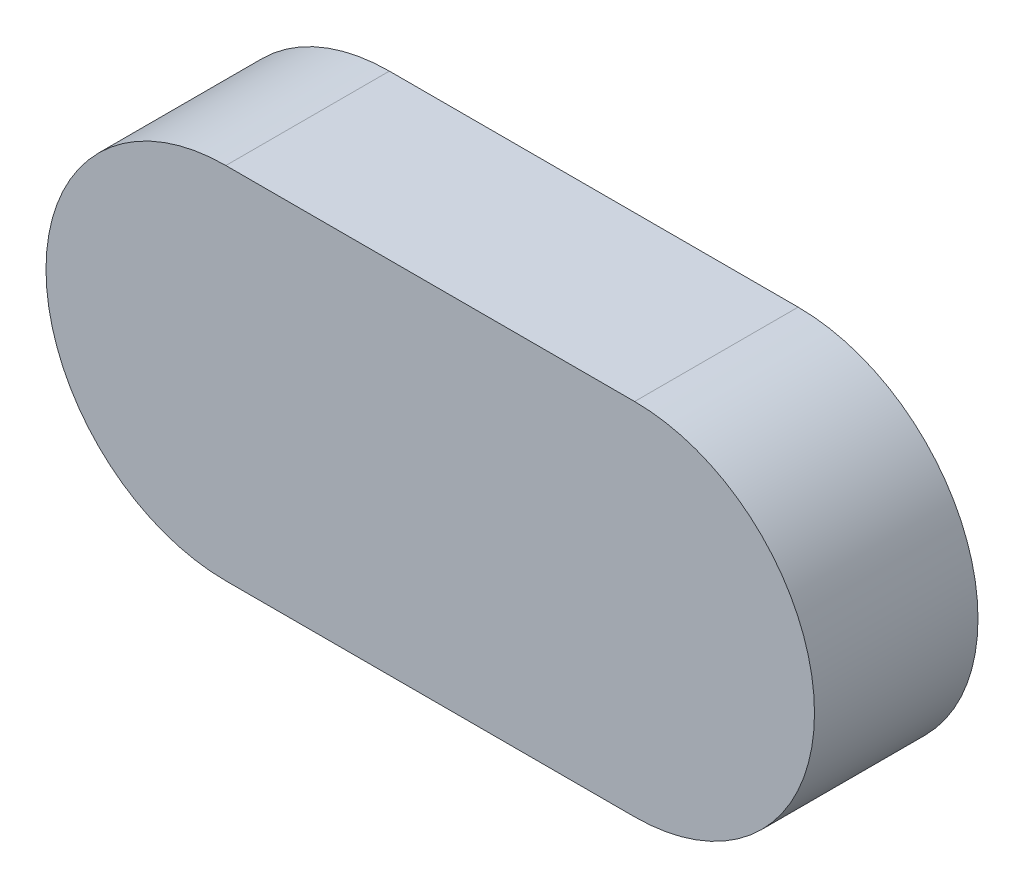
ISO-10303-21;
HEADER;
FILE_DESCRIPTION(('STEP AP214'),'2;1');
FILE_NAME('part.step','',(''),(''),'','','');
FILE_SCHEMA(('AUTOMOTIVE_DESIGN { 1 0 10303 214 1 1 1 1 }'));
ENDSEC;
DATA;
#1=APPLICATION_CONTEXT('core data for automotive mechanical design processes');
#2=APPLICATION_PROTOCOL_DEFINITION('international standard','automotive_design',2000,#1);
#3=PRODUCT_CONTEXT('',#1,'mechanical');
#4=PRODUCT('Part','Part','',(#3));
#5=PRODUCT_RELATED_PRODUCT_CATEGORY('part','',(#4));
#6=PRODUCT_DEFINITION_FORMATION('','',#4);
#7=PRODUCT_DEFINITION_CONTEXT('part definition',#1,'design');
#8=PRODUCT_DEFINITION('design','',#6,#7);
#9=PRODUCT_DEFINITION_SHAPE('','',#8);
#10=(LENGTH_UNIT() NAMED_UNIT(*) SI_UNIT(.MILLI.,.METRE.));
#11=(NAMED_UNIT(*) PLANE_ANGLE_UNIT() SI_UNIT($,.RADIAN.));
#12=(NAMED_UNIT(*) SI_UNIT($,.STERADIAN.) SOLID_ANGLE_UNIT());
#13=UNCERTAINTY_MEASURE_WITH_UNIT(LENGTH_MEASURE(1.E-05),#10,'distance_accuracy_value','');
#14=(GEOMETRIC_REPRESENTATION_CONTEXT(3) GLOBAL_UNCERTAINTY_ASSIGNED_CONTEXT((#13)) GLOBAL_UNIT_ASSIGNED_CONTEXT((#10,
#11,#12)) REPRESENTATION_CONTEXT('',''));
#15=CARTESIAN_POINT('',(0.,0.,0.));
#16=DIRECTION('',(0.,0.,1.));
#17=DIRECTION('',(1.,0.,0.));
#18=AXIS2_PLACEMENT_3D('',#15,#16,#17);
#19=CARTESIAN_POINT('',(20.,50.,10.));
#20=DIRECTION('',(0.,0.,-1.));
#21=DIRECTION('',(-1.,0.,0.));
#22=AXIS2_PLACEMENT_3D('',#19,#20,#21);
#23=CYLINDRICAL_SURFACE('',#22,11.);
#24=CARTESIAN_POINT('',(20.,50.,0.));
#25=DIRECTION('',(0.,0.,1.));
#26=DIRECTION('',(1.,0.,0.));
#27=AXIS2_PLACEMENT_3D('',#24,#25,#26);
#28=CIRCLE('',#27,11.);
#29=CARTESIAN_POINT('',(20.,61.,0.));
#30=VERTEX_POINT('',#29);
#31=CARTESIAN_POINT('',(20.,39.,0.));
#32=VERTEX_POINT('',#31);
#33=EDGE_CURVE('E104',#30,#32,#28,.T.);
#34=ORIENTED_EDGE('',*,*,#33,.T.);
#35=DIRECTION('',(0.,0.,-1.));
#36=VECTOR('',#35,1.);
#37=CARTESIAN_POINT('',(20.,39.,10.));
#38=LINE('',#37,#36);
#39=CARTESIAN_POINT('',(20.,39.,10.));
#40=VERTEX_POINT('',#39);
#41=EDGE_CURVE('E11',#40,#32,#38,.T.);
#42=ORIENTED_EDGE('',*,*,#41,.F.);
#43=CARTESIAN_POINT('',(20.,50.,10.));
#44=DIRECTION('',(0.,0.,1.));
#45=DIRECTION('',(1.,0.,0.));
#46=AXIS2_PLACEMENT_3D('',#43,#44,#45);
#47=CIRCLE('',#46,11.);
#48=CARTESIAN_POINT('',(20.,61.,10.));
#49=VERTEX_POINT('',#48);
#50=EDGE_CURVE('E92',#49,#40,#47,.T.);
#51=ORIENTED_EDGE('',*,*,#50,.F.);
#52=DIRECTION('',(0.,0.,-1.));
#53=VECTOR('',#52,1.);
#54=CARTESIAN_POINT('',(20.,61.,10.));
#55=LINE('',#54,#53);
#56=EDGE_CURVE('E100',#49,#30,#55,.T.);
#57=ORIENTED_EDGE('',*,*,#56,.T.);
#58=EDGE_LOOP('',(#34,#42,#51,#57));
#59=FACE_BOUND('',#58,.T.);
#60=ADVANCED_FACE('F41',(#59),#23,.T.);
#61=CARTESIAN_POINT('',(20.,39.,10.));
#62=DIRECTION('',(0.,1.,0.));
#63=DIRECTION('',(0.,0.,1.));
#64=AXIS2_PLACEMENT_3D('',#61,#62,#63);
#65=PLANE('',#64);
#66=DIRECTION('',(1.,0.,0.));
#67=VECTOR('',#66,1.);
#68=CARTESIAN_POINT('',(20.,39.,0.));
#69=LINE('',#68,#67);
#70=CARTESIAN_POINT('',(45.,39.,0.));
#71=VERTEX_POINT('',#70);
#72=EDGE_CURVE('E96',#32,#71,#69,.T.);
#73=ORIENTED_EDGE('',*,*,#72,.T.);
#74=DIRECTION('',(0.,0.,-1.));
#75=VECTOR('',#74,1.);
#76=CARTESIAN_POINT('',(45.,39.,10.));
#77=LINE('',#76,#75);
#78=CARTESIAN_POINT('',(45.,39.,10.));
#79=VERTEX_POINT('',#78);
#80=EDGE_CURVE('E49',#79,#71,#77,.T.);
#81=ORIENTED_EDGE('',*,*,#80,.F.);
#82=DIRECTION('',(1.,0.,0.));
#83=VECTOR('',#82,1.);
#84=CARTESIAN_POINT('',(20.,39.,10.));
#85=LINE('',#84,#83);
#86=EDGE_CURVE('E87',#40,#79,#85,.T.);
#87=ORIENTED_EDGE('',*,*,#86,.F.);
#88=ORIENTED_EDGE('',*,*,#41,.T.);
#89=EDGE_LOOP('',(#73,#81,#87,#88));
#90=FACE_BOUND('',#89,.T.);
#91=ADVANCED_FACE('F95',(#90),#65,.F.);
#92=CARTESIAN_POINT('',(45.,50.,10.));
#93=DIRECTION('',(0.,0.,-1.));
#94=DIRECTION('',(-1.,0.,0.));
#95=AXIS2_PLACEMENT_3D('',#92,#93,#94);
#96=CYLINDRICAL_SURFACE('',#95,11.);
#97=CARTESIAN_POINT('',(45.,50.,0.));
#98=DIRECTION('',(0.,0.,1.));
#99=DIRECTION('',(1.,0.,0.));
#100=AXIS2_PLACEMENT_3D('',#97,#98,#99);
#101=CIRCLE('',#100,11.);
#102=CARTESIAN_POINT('',(45.,61.,0.));
#103=VERTEX_POINT('',#102);
#104=EDGE_CURVE('E74',#71,#103,#101,.T.);
#105=ORIENTED_EDGE('',*,*,#104,.T.);
#106=DIRECTION('',(0.,0.,-1.));
#107=VECTOR('',#106,1.);
#108=CARTESIAN_POINT('',(45.,61.,10.));
#109=LINE('',#108,#107);
#110=CARTESIAN_POINT('',(45.,61.,10.));
#111=VERTEX_POINT('',#110);
#112=EDGE_CURVE('E97',#111,#103,#109,.T.);
#113=ORIENTED_EDGE('',*,*,#112,.F.);
#114=CARTESIAN_POINT('',(45.,50.,10.));
#115=DIRECTION('',(0.,0.,1.));
#116=DIRECTION('',(1.,0.,0.));
#117=AXIS2_PLACEMENT_3D('',#114,#115,#116);
#118=CIRCLE('',#117,11.);
#119=EDGE_CURVE('E90',#79,#111,#118,.T.);
#120=ORIENTED_EDGE('',*,*,#119,.F.);
#121=ORIENTED_EDGE('',*,*,#80,.T.);
#122=EDGE_LOOP('',(#105,#113,#120,#121));
#123=FACE_BOUND('',#122,.T.);
#124=ADVANCED_FACE('F98',(#123),#96,.T.);
#125=CARTESIAN_POINT('',(20.,61.,10.));
#126=DIRECTION('',(0.,-1.,0.));
#127=DIRECTION('',(0.,0.,-1.));
#128=AXIS2_PLACEMENT_3D('',#125,#126,#127);
#129=PLANE('',#128);
#130=DIRECTION('',(-1.,0.,0.));
#131=VECTOR('',#130,1.);
#132=CARTESIAN_POINT('',(20.,61.,0.));
#133=LINE('',#132,#131);
#134=EDGE_CURVE('E80',#103,#30,#133,.T.);
#135=ORIENTED_EDGE('',*,*,#134,.T.);
#136=ORIENTED_EDGE('',*,*,#56,.F.);
#137=DIRECTION('',(-1.,0.,0.));
#138=VECTOR('',#137,1.);
#139=CARTESIAN_POINT('',(20.,61.,10.));
#140=LINE('',#139,#138);
#141=EDGE_CURVE('E57',#111,#49,#140,.T.);
#142=ORIENTED_EDGE('',*,*,#141,.F.);
#143=ORIENTED_EDGE('',*,*,#112,.T.);
#144=EDGE_LOOP('',(#135,#136,#142,#143));
#145=FACE_BOUND('',#144,.T.);
#146=ADVANCED_FACE('F111',(#145),#129,.F.);
#147=CARTESIAN_POINT('',(20.,50.,10.));
#148=DIRECTION('',(0.,0.,1.));
#149=DIRECTION('',(1.,0.,0.));
#150=AXIS2_PLACEMENT_3D('',#147,#148,#149);
#151=PLANE('',#150);
#152=ORIENTED_EDGE('',*,*,#50,.T.);
#153=ORIENTED_EDGE('',*,*,#86,.T.);
#154=ORIENTED_EDGE('',*,*,#119,.T.);
#155=ORIENTED_EDGE('',*,*,#141,.T.);
#156=EDGE_LOOP('',(#152,#153,#154,#155));
#157=FACE_BOUND('',#156,.T.);
#158=ADVANCED_FACE('F88',(#157),#151,.T.);
#159=CARTESIAN_POINT('',(20.,50.,0.));
#160=DIRECTION('',(0.,0.,1.));
#161=DIRECTION('',(1.,0.,0.));
#162=AXIS2_PLACEMENT_3D('',#159,#160,#161);
#163=PLANE('',#162);
#164=ORIENTED_EDGE('',*,*,#33,.F.);
#165=ORIENTED_EDGE('',*,*,#134,.F.);
#166=ORIENTED_EDGE('',*,*,#104,.F.);
#167=ORIENTED_EDGE('',*,*,#72,.F.);
#168=EDGE_LOOP('',(#164,#165,#166,#167));
#169=FACE_BOUND('',#168,.T.);
#170=ADVANCED_FACE('F114',(#169),#163,.F.);
#171=CLOSED_SHELL('',(#60,#91,#124,#146,#158,#170));
#172=MANIFOLD_SOLID_BREP('B2',#171);
#173=ADVANCED_BREP_SHAPE_REPRESENTATION('',(#18,#172),#14);
#174=SHAPE_DEFINITION_REPRESENTATION(#9,#173);
ENDSEC;
END-ISO-10303-21;
